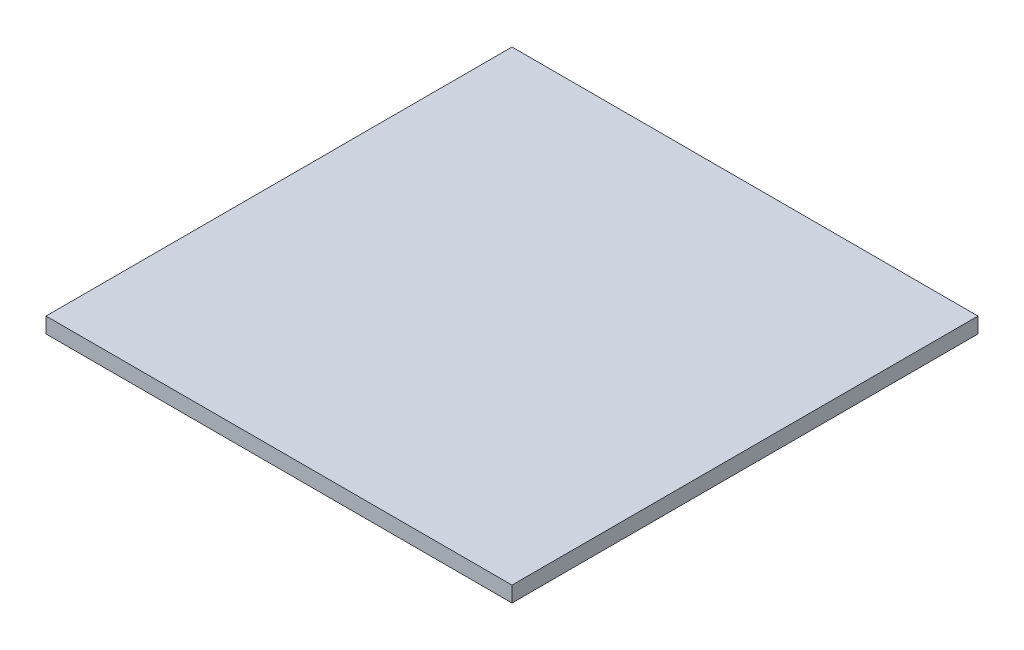
ISO-10303-21;
HEADER;
FILE_DESCRIPTION(('STEP AP214'),'2;1');
FILE_NAME('part.step','',(''),(''),'','','');
FILE_SCHEMA(('AUTOMOTIVE_DESIGN { 1 0 10303 214 1 1 1 1 }'));
ENDSEC;
DATA;
#1=APPLICATION_CONTEXT('core data for automotive mechanical design processes');
#2=APPLICATION_PROTOCOL_DEFINITION('international standard','automotive_design',2000,#1);
#3=PRODUCT_CONTEXT('',#1,'mechanical');
#4=PRODUCT('Part','Part','',(#3));
#5=PRODUCT_RELATED_PRODUCT_CATEGORY('part','',(#4));
#6=PRODUCT_DEFINITION_FORMATION('','',#4);
#7=PRODUCT_DEFINITION_CONTEXT('part definition',#1,'design');
#8=PRODUCT_DEFINITION('design','',#6,#7);
#9=PRODUCT_DEFINITION_SHAPE('','',#8);
#10=(LENGTH_UNIT() NAMED_UNIT(*) SI_UNIT(.MILLI.,.METRE.));
#11=(NAMED_UNIT(*) PLANE_ANGLE_UNIT() SI_UNIT($,.RADIAN.));
#12=(NAMED_UNIT(*) SI_UNIT($,.STERADIAN.) SOLID_ANGLE_UNIT());
#13=UNCERTAINTY_MEASURE_WITH_UNIT(LENGTH_MEASURE(1.E-05),#10,'distance_accuracy_value','');
#14=(GEOMETRIC_REPRESENTATION_CONTEXT(3) GLOBAL_UNCERTAINTY_ASSIGNED_CONTEXT((#13)) GLOBAL_UNIT_ASSIGNED_CONTEXT((#10,
#11,#12)) REPRESENTATION_CONTEXT('',''));
#15=CARTESIAN_POINT('',(0.,0.,0.));
#16=DIRECTION('',(0.,0.,1.));
#17=DIRECTION('',(1.,0.,0.));
#18=AXIS2_PLACEMENT_3D('',#15,#16,#17);
#19=CARTESIAN_POINT('',(0.,1.,0.));
#20=DIRECTION('',(1.,0.,0.));
#21=DIRECTION('',(0.,0.,-1.));
#22=AXIS2_PLACEMENT_3D('',#19,#20,#21);
#23=PLANE('',#22);
#24=DIRECTION('',(0.,0.,1.));
#25=VECTOR('',#24,1.);
#26=CARTESIAN_POINT('',(0.,0.,0.));
#27=LINE('',#26,#25);
#28=CARTESIAN_POINT('',(0.,0.,-30.));
#29=VERTEX_POINT('',#28);
#30=CARTESIAN_POINT('',(0.,0.,0.));
#31=VERTEX_POINT('',#30);
#32=EDGE_CURVE('E118',#29,#31,#27,.T.);
#33=ORIENTED_EDGE('',*,*,#32,.T.);
#34=DIRECTION('',(0.,-1.,0.));
#35=VECTOR('',#34,1.);
#36=CARTESIAN_POINT('',(0.,1.,0.));
#37=LINE('',#36,#35);
#38=CARTESIAN_POINT('',(0.,1.,0.));
#39=VERTEX_POINT('',#38);
#40=EDGE_CURVE('E12',#39,#31,#37,.T.);
#41=ORIENTED_EDGE('',*,*,#40,.F.);
#42=DIRECTION('',(0.,0.,1.));
#43=VECTOR('',#42,1.);
#44=CARTESIAN_POINT('',(0.,1.,0.));
#45=LINE('',#44,#43);
#46=CARTESIAN_POINT('',(0.,1.,-30.));
#47=VERTEX_POINT('',#46);
#48=EDGE_CURVE('E87',#47,#39,#45,.T.);
#49=ORIENTED_EDGE('',*,*,#48,.F.);
#50=DIRECTION('',(0.,-1.,0.));
#51=VECTOR('',#50,1.);
#52=CARTESIAN_POINT('',(0.,1.,-30.));
#53=LINE('',#52,#51);
#54=EDGE_CURVE('E98',#47,#29,#53,.T.);
#55=ORIENTED_EDGE('',*,*,#54,.T.);
#56=EDGE_LOOP('',(#33,#41,#49,#55));
#57=FACE_BOUND('',#56,.T.);
#58=ADVANCED_FACE('F36',(#57),#23,.F.);
#59=CARTESIAN_POINT('',(0.,1.,0.));
#60=DIRECTION('',(0.,0.,-1.));
#61=DIRECTION('',(-1.,0.,0.));
#62=AXIS2_PLACEMENT_3D('',#59,#60,#61);
#63=PLANE('',#62);
#64=DIRECTION('',(1.,0.,0.));
#65=VECTOR('',#64,1.);
#66=CARTESIAN_POINT('',(0.,0.,0.));
#67=LINE('',#66,#65);
#68=CARTESIAN_POINT('',(30.,0.,0.));
#69=VERTEX_POINT('',#68);
#70=EDGE_CURVE('E92',#31,#69,#67,.T.);
#71=ORIENTED_EDGE('',*,*,#70,.T.);
#72=DIRECTION('',(0.,-1.,0.));
#73=VECTOR('',#72,1.);
#74=CARTESIAN_POINT('',(30.,1.,0.));
#75=LINE('',#74,#73);
#76=CARTESIAN_POINT('',(30.,1.,0.));
#77=VERTEX_POINT('',#76);
#78=EDGE_CURVE('E44',#77,#69,#75,.T.);
#79=ORIENTED_EDGE('',*,*,#78,.F.);
#80=DIRECTION('',(1.,0.,0.));
#81=VECTOR('',#80,1.);
#82=CARTESIAN_POINT('',(0.,1.,0.));
#83=LINE('',#82,#81);
#84=EDGE_CURVE('E82',#39,#77,#83,.T.);
#85=ORIENTED_EDGE('',*,*,#84,.F.);
#86=ORIENTED_EDGE('',*,*,#40,.T.);
#87=EDGE_LOOP('',(#71,#79,#85,#86));
#88=FACE_BOUND('',#87,.T.);
#89=ADVANCED_FACE('F91',(#88),#63,.F.);
#90=CARTESIAN_POINT('',(30.,1.,0.));
#91=DIRECTION('',(-1.,0.,0.));
#92=DIRECTION('',(0.,0.,1.));
#93=AXIS2_PLACEMENT_3D('',#90,#91,#92);
#94=PLANE('',#93);
#95=DIRECTION('',(0.,0.,-1.));
#96=VECTOR('',#95,1.);
#97=CARTESIAN_POINT('',(30.,0.,0.));
#98=LINE('',#97,#96);
#99=CARTESIAN_POINT('',(30.,0.,-30.));
#100=VERTEX_POINT('',#99);
#101=EDGE_CURVE('E69',#69,#100,#98,.T.);
#102=ORIENTED_EDGE('',*,*,#101,.T.);
#103=DIRECTION('',(0.,-1.,0.));
#104=VECTOR('',#103,1.);
#105=CARTESIAN_POINT('',(30.,1.,-30.));
#106=LINE('',#105,#104);
#107=CARTESIAN_POINT('',(30.,1.,-30.));
#108=VERTEX_POINT('',#107);
#109=EDGE_CURVE('E93',#108,#100,#106,.T.);
#110=ORIENTED_EDGE('',*,*,#109,.F.);
#111=DIRECTION('',(0.,0.,-1.));
#112=VECTOR('',#111,1.);
#113=CARTESIAN_POINT('',(30.,1.,0.));
#114=LINE('',#113,#112);
#115=EDGE_CURVE('E85',#77,#108,#114,.T.);
#116=ORIENTED_EDGE('',*,*,#115,.F.);
#117=ORIENTED_EDGE('',*,*,#78,.T.);
#118=EDGE_LOOP('',(#102,#110,#116,#117));
#119=FACE_BOUND('',#118,.T.);
#120=ADVANCED_FACE('F94',(#119),#94,.F.);
#121=CARTESIAN_POINT('',(0.,1.,-30.));
#122=DIRECTION('',(0.,0.,1.));
#123=DIRECTION('',(1.,0.,0.));
#124=AXIS2_PLACEMENT_3D('',#121,#122,#123);
#125=PLANE('',#124);
#126=DIRECTION('',(-1.,0.,0.));
#127=VECTOR('',#126,1.);
#128=CARTESIAN_POINT('',(0.,0.,-30.));
#129=LINE('',#128,#127);
#130=EDGE_CURVE('E75',#100,#29,#129,.T.);
#131=ORIENTED_EDGE('',*,*,#130,.T.);
#132=ORIENTED_EDGE('',*,*,#54,.F.);
#133=DIRECTION('',(-1.,0.,0.));
#134=VECTOR('',#133,1.);
#135=CARTESIAN_POINT('',(0.,1.,-30.));
#136=LINE('',#135,#134);
#137=EDGE_CURVE('E52',#108,#47,#136,.T.);
#138=ORIENTED_EDGE('',*,*,#137,.F.);
#139=ORIENTED_EDGE('',*,*,#109,.T.);
#140=EDGE_LOOP('',(#131,#132,#138,#139));
#141=FACE_BOUND('',#140,.T.);
#142=ADVANCED_FACE('F113',(#141),#125,.F.);
#143=CARTESIAN_POINT('',(0.,1.,0.));
#144=DIRECTION('',(0.,-1.,0.));
#145=DIRECTION('',(0.,0.,-1.));
#146=AXIS2_PLACEMENT_3D('',#143,#144,#145);
#147=PLANE('',#146);
#148=ORIENTED_EDGE('',*,*,#48,.T.);
#149=ORIENTED_EDGE('',*,*,#84,.T.);
#150=ORIENTED_EDGE('',*,*,#115,.T.);
#151=ORIENTED_EDGE('',*,*,#137,.T.);
#152=EDGE_LOOP('',(#148,#149,#150,#151));
#153=FACE_BOUND('',#152,.T.);
#154=ADVANCED_FACE('F83',(#153),#147,.F.);
#155=CARTESIAN_POINT('',(0.,0.,0.));
#156=DIRECTION('',(0.,-1.,0.));
#157=DIRECTION('',(0.,0.,-1.));
#158=AXIS2_PLACEMENT_3D('',#155,#156,#157);
#159=PLANE('',#158);
#160=ORIENTED_EDGE('',*,*,#32,.F.);
#161=ORIENTED_EDGE('',*,*,#130,.F.);
#162=ORIENTED_EDGE('',*,*,#101,.F.);
#163=ORIENTED_EDGE('',*,*,#70,.F.);
#164=EDGE_LOOP('',(#160,#161,#162,#163));
#165=FACE_BOUND('',#164,.T.);
#166=ADVANCED_FACE('F116',(#165),#159,.T.);
#167=CLOSED_SHELL('',(#58,#89,#120,#142,#154,#166));
#168=MANIFOLD_SOLID_BREP('B2',#167);
#169=ADVANCED_BREP_SHAPE_REPRESENTATION('',(#18,#168),#14);
#170=SHAPE_DEFINITION_REPRESENTATION(#9,#169);
ENDSEC;
END-ISO-10303-21;
